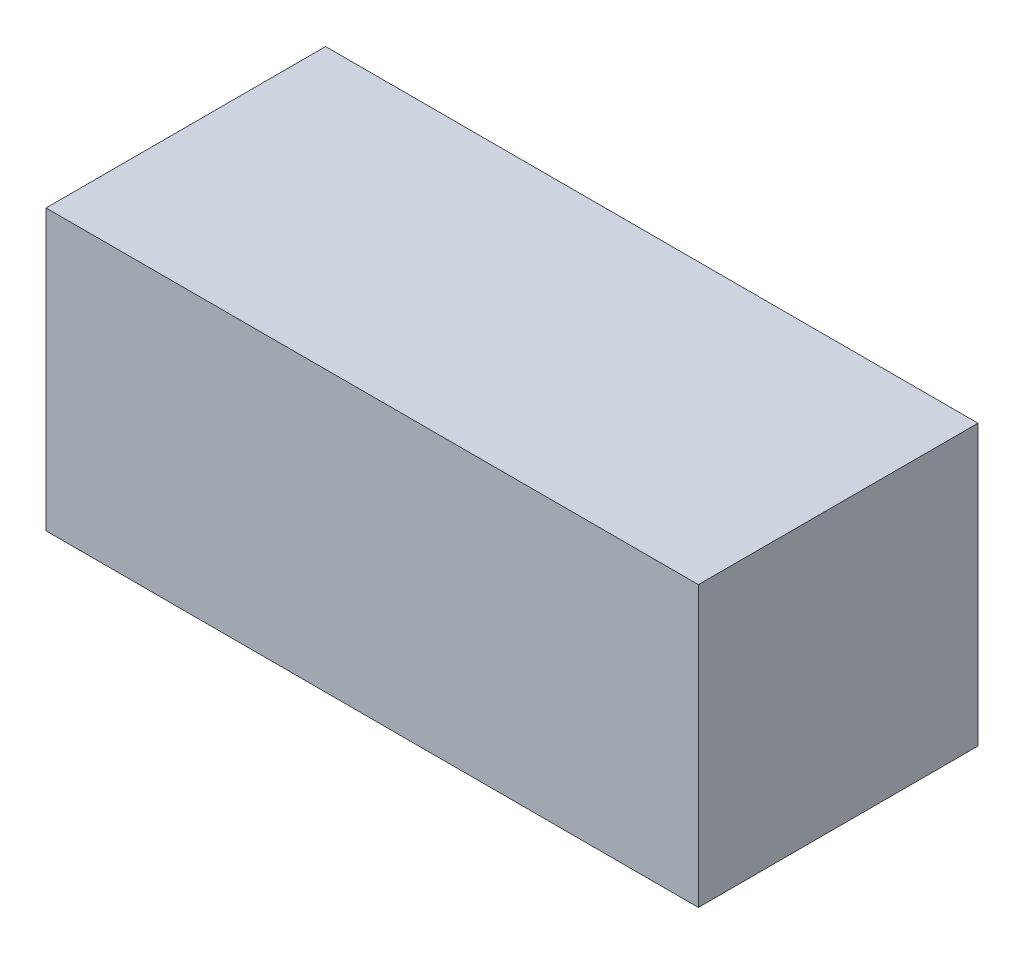
ISO-10303-21;
HEADER;
FILE_DESCRIPTION(('STEP AP214'),'2;1');
FILE_NAME('part.step','',(''),(''),'','','');
FILE_SCHEMA(('AUTOMOTIVE_DESIGN { 1 0 10303 214 1 1 1 1 }'));
ENDSEC;
DATA;
#1=APPLICATION_CONTEXT('core data for automotive mechanical design processes');
#2=APPLICATION_PROTOCOL_DEFINITION('international standard','automotive_design',2000,#1);
#3=PRODUCT_CONTEXT('',#1,'mechanical');
#4=PRODUCT('Part','Part','',(#3));
#5=PRODUCT_RELATED_PRODUCT_CATEGORY('part','',(#4));
#6=PRODUCT_DEFINITION_FORMATION('','',#4);
#7=PRODUCT_DEFINITION_CONTEXT('part definition',#1,'design');
#8=PRODUCT_DEFINITION('design','',#6,#7);
#9=PRODUCT_DEFINITION_SHAPE('','',#8);
#10=(LENGTH_UNIT() NAMED_UNIT(*) SI_UNIT(.MILLI.,.METRE.));
#11=(NAMED_UNIT(*) PLANE_ANGLE_UNIT() SI_UNIT($,.RADIAN.));
#12=(NAMED_UNIT(*) SI_UNIT($,.STERADIAN.) SOLID_ANGLE_UNIT());
#13=UNCERTAINTY_MEASURE_WITH_UNIT(LENGTH_MEASURE(1.E-05),#10,'distance_accuracy_value','');
#14=(GEOMETRIC_REPRESENTATION_CONTEXT(3) GLOBAL_UNCERTAINTY_ASSIGNED_CONTEXT((#13)) GLOBAL_UNIT_ASSIGNED_CONTEXT((#10,
#11,#12)) REPRESENTATION_CONTEXT('',''));
#15=CARTESIAN_POINT('',(0.,0.,0.));
#16=DIRECTION('',(0.,0.,1.));
#17=DIRECTION('',(1.,0.,0.));
#18=AXIS2_PLACEMENT_3D('',#15,#16,#17);
#19=CARTESIAN_POINT('',(35.,30.,15.));
#20=DIRECTION('',(-1.,0.,0.));
#21=DIRECTION('',(0.,0.,1.));
#22=AXIS2_PLACEMENT_3D('',#19,#20,#21);
#23=PLANE('',#22);
#24=DIRECTION('',(0.,0.,-1.));
#25=VECTOR('',#24,1.);
#26=CARTESIAN_POINT('',(35.,0.,15.));
#27=LINE('',#26,#25);
#28=CARTESIAN_POINT('',(35.,0.,15.));
#29=VERTEX_POINT('',#28);
#30=CARTESIAN_POINT('',(35.,0.,-15.));
#31=VERTEX_POINT('',#30);
#32=EDGE_CURVE('E99',#29,#31,#27,.T.);
#33=ORIENTED_EDGE('',*,*,#32,.T.);
#34=DIRECTION('',(0.,-1.,0.));
#35=VECTOR('',#34,1.);
#36=CARTESIAN_POINT('',(35.,30.,-15.));
#37=LINE('',#36,#35);
#38=CARTESIAN_POINT('',(35.,30.,-15.));
#39=VERTEX_POINT('',#38);
#40=EDGE_CURVE('E11',#39,#31,#37,.T.);
#41=ORIENTED_EDGE('',*,*,#40,.F.);
#42=DIRECTION('',(0.,0.,-1.));
#43=VECTOR('',#42,1.);
#44=CARTESIAN_POINT('',(35.,30.,15.));
#45=LINE('',#44,#43);
#46=CARTESIAN_POINT('',(35.,30.,15.));
#47=VERTEX_POINT('',#46);
#48=EDGE_CURVE('E87',#47,#39,#45,.T.);
#49=ORIENTED_EDGE('',*,*,#48,.F.);
#50=DIRECTION('',(0.,-1.,0.));
#51=VECTOR('',#50,1.);
#52=CARTESIAN_POINT('',(35.,30.,15.));
#53=LINE('',#52,#51);
#54=EDGE_CURVE('E95',#47,#29,#53,.T.);
#55=ORIENTED_EDGE('',*,*,#54,.T.);
#56=EDGE_LOOP('',(#33,#41,#49,#55));
#57=FACE_BOUND('',#56,.T.);
#58=ADVANCED_FACE('F36',(#57),#23,.F.);
#59=CARTESIAN_POINT('',(-35.,30.,-15.));
#60=DIRECTION('',(0.,0.,1.));
#61=DIRECTION('',(1.,0.,0.));
#62=AXIS2_PLACEMENT_3D('',#59,#60,#61);
#63=PLANE('',#62);
#64=DIRECTION('',(-1.,0.,0.));
#65=VECTOR('',#64,1.);
#66=CARTESIAN_POINT('',(-35.,0.,-15.));
#67=LINE('',#66,#65);
#68=CARTESIAN_POINT('',(-35.,0.,-15.));
#69=VERTEX_POINT('',#68);
#70=EDGE_CURVE('E91',#31,#69,#67,.T.);
#71=ORIENTED_EDGE('',*,*,#70,.T.);
#72=DIRECTION('',(0.,-1.,0.));
#73=VECTOR('',#72,1.);
#74=CARTESIAN_POINT('',(-35.,30.,-15.));
#75=LINE('',#74,#73);
#76=CARTESIAN_POINT('',(-35.,30.,-15.));
#77=VERTEX_POINT('',#76);
#78=EDGE_CURVE('E44',#77,#69,#75,.T.);
#79=ORIENTED_EDGE('',*,*,#78,.F.);
#80=DIRECTION('',(-1.,0.,0.));
#81=VECTOR('',#80,1.);
#82=CARTESIAN_POINT('',(-35.,30.,-15.));
#83=LINE('',#82,#81);
#84=EDGE_CURVE('E82',#39,#77,#83,.T.);
#85=ORIENTED_EDGE('',*,*,#84,.F.);
#86=ORIENTED_EDGE('',*,*,#40,.T.);
#87=EDGE_LOOP('',(#71,#79,#85,#86));
#88=FACE_BOUND('',#87,.T.);
#89=ADVANCED_FACE('F90',(#88),#63,.F.);
#90=CARTESIAN_POINT('',(-35.,30.,15.));
#91=DIRECTION('',(1.,0.,0.));
#92=DIRECTION('',(0.,0.,-1.));
#93=AXIS2_PLACEMENT_3D('',#90,#91,#92);
#94=PLANE('',#93);
#95=DIRECTION('',(0.,0.,1.));
#96=VECTOR('',#95,1.);
#97=CARTESIAN_POINT('',(-35.,0.,15.));
#98=LINE('',#97,#96);
#99=CARTESIAN_POINT('',(-35.,0.,15.));
#100=VERTEX_POINT('',#99);
#101=EDGE_CURVE('E69',#69,#100,#98,.T.);
#102=ORIENTED_EDGE('',*,*,#101,.T.);
#103=DIRECTION('',(0.,-1.,0.));
#104=VECTOR('',#103,1.);
#105=CARTESIAN_POINT('',(-35.,30.,15.));
#106=LINE('',#105,#104);
#107=CARTESIAN_POINT('',(-35.,30.,15.));
#108=VERTEX_POINT('',#107);
#109=EDGE_CURVE('E92',#108,#100,#106,.T.);
#110=ORIENTED_EDGE('',*,*,#109,.F.);
#111=DIRECTION('',(0.,0.,1.));
#112=VECTOR('',#111,1.);
#113=CARTESIAN_POINT('',(-35.,30.,15.));
#114=LINE('',#113,#112);
#115=EDGE_CURVE('E85',#77,#108,#114,.T.);
#116=ORIENTED_EDGE('',*,*,#115,.F.);
#117=ORIENTED_EDGE('',*,*,#78,.T.);
#118=EDGE_LOOP('',(#102,#110,#116,#117));
#119=FACE_BOUND('',#118,.T.);
#120=ADVANCED_FACE('F93',(#119),#94,.F.);
#121=CARTESIAN_POINT('',(-35.,30.,15.));
#122=DIRECTION('',(0.,0.,-1.));
#123=DIRECTION('',(-1.,0.,0.));
#124=AXIS2_PLACEMENT_3D('',#121,#122,#123);
#125=PLANE('',#124);
#126=DIRECTION('',(1.,0.,0.));
#127=VECTOR('',#126,1.);
#128=CARTESIAN_POINT('',(-35.,0.,15.));
#129=LINE('',#128,#127);
#130=EDGE_CURVE('E75',#100,#29,#129,.T.);
#131=ORIENTED_EDGE('',*,*,#130,.T.);
#132=ORIENTED_EDGE('',*,*,#54,.F.);
#133=DIRECTION('',(1.,0.,0.));
#134=VECTOR('',#133,1.);
#135=CARTESIAN_POINT('',(-35.,30.,15.));
#136=LINE('',#135,#134);
#137=EDGE_CURVE('E52',#108,#47,#136,.T.);
#138=ORIENTED_EDGE('',*,*,#137,.F.);
#139=ORIENTED_EDGE('',*,*,#109,.T.);
#140=EDGE_LOOP('',(#131,#132,#138,#139));
#141=FACE_BOUND('',#140,.T.);
#142=ADVANCED_FACE('F106',(#141),#125,.F.);
#143=CARTESIAN_POINT('',(0.,30.,0.));
#144=DIRECTION('',(0.,-1.,0.));
#145=DIRECTION('',(0.,0.,-1.));
#146=AXIS2_PLACEMENT_3D('',#143,#144,#145);
#147=PLANE('',#146);
#148=ORIENTED_EDGE('',*,*,#48,.T.);
#149=ORIENTED_EDGE('',*,*,#84,.T.);
#150=ORIENTED_EDGE('',*,*,#115,.T.);
#151=ORIENTED_EDGE('',*,*,#137,.T.);
#152=EDGE_LOOP('',(#148,#149,#150,#151));
#153=FACE_BOUND('',#152,.T.);
#154=ADVANCED_FACE('F83',(#153),#147,.F.);
#155=CARTESIAN_POINT('',(0.,0.,0.));
#156=DIRECTION('',(0.,-1.,0.));
#157=DIRECTION('',(0.,0.,-1.));
#158=AXIS2_PLACEMENT_3D('',#155,#156,#157);
#159=PLANE('',#158);
#160=ORIENTED_EDGE('',*,*,#32,.F.);
#161=ORIENTED_EDGE('',*,*,#130,.F.);
#162=ORIENTED_EDGE('',*,*,#101,.F.);
#163=ORIENTED_EDGE('',*,*,#70,.F.);
#164=EDGE_LOOP('',(#160,#161,#162,#163));
#165=FACE_BOUND('',#164,.T.);
#166=ADVANCED_FACE('F109',(#165),#159,.T.);
#167=CLOSED_SHELL('',(#58,#89,#120,#142,#154,#166));
#168=MANIFOLD_SOLID_BREP('B2',#167);
#169=ADVANCED_BREP_SHAPE_REPRESENTATION('',(#18,#168),#14);
#170=SHAPE_DEFINITION_REPRESENTATION(#9,#169);
ENDSEC;
END-ISO-10303-21;
